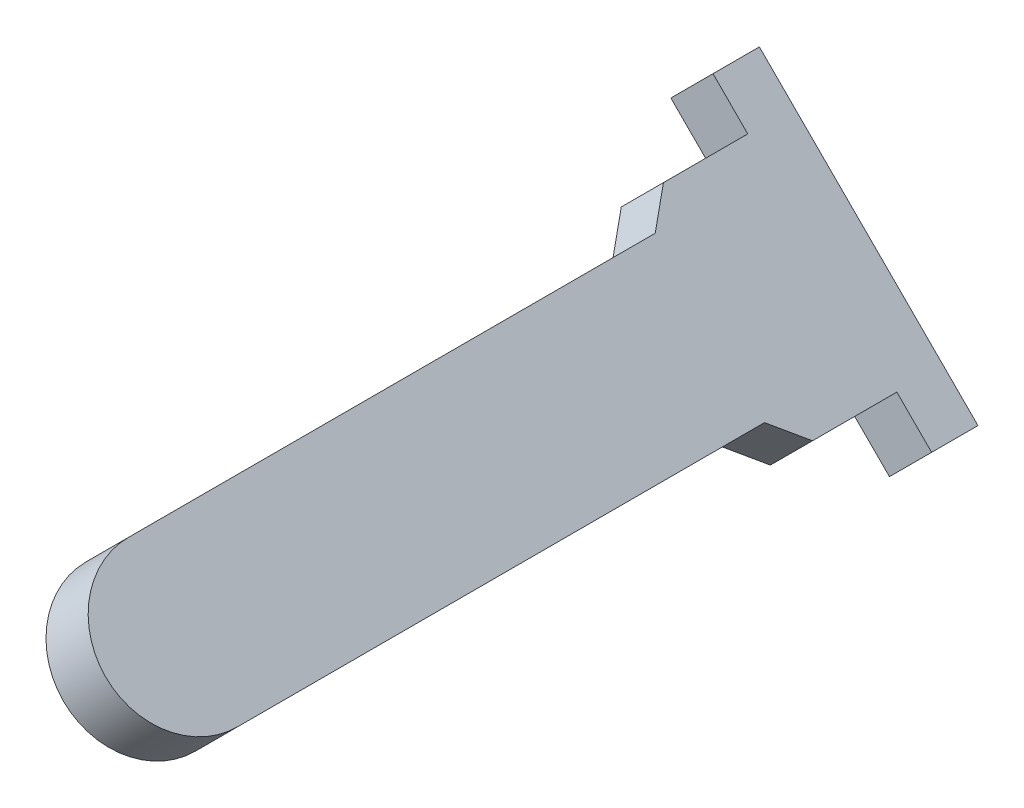
ISO-10303-21;
HEADER;
FILE_DESCRIPTION(('STEP AP214'),'2;1');
FILE_NAME('part.step','',(''),(''),'','','');
FILE_SCHEMA(('AUTOMOTIVE_DESIGN { 1 0 10303 214 1 1 1 1 }'));
ENDSEC;
DATA;
#1=APPLICATION_CONTEXT('core data for automotive mechanical design processes');
#2=APPLICATION_PROTOCOL_DEFINITION('international standard','automotive_design',2000,#1);
#3=PRODUCT_CONTEXT('',#1,'mechanical');
#4=PRODUCT('Part','Part','',(#3));
#5=PRODUCT_RELATED_PRODUCT_CATEGORY('part','',(#4));
#6=PRODUCT_DEFINITION_FORMATION('','',#4);
#7=PRODUCT_DEFINITION_CONTEXT('part definition',#1,'design');
#8=PRODUCT_DEFINITION('design','',#6,#7);
#9=PRODUCT_DEFINITION_SHAPE('','',#8);
#10=(LENGTH_UNIT() NAMED_UNIT(*) SI_UNIT(.MILLI.,.METRE.));
#11=(NAMED_UNIT(*) PLANE_ANGLE_UNIT() SI_UNIT($,.RADIAN.));
#12=(NAMED_UNIT(*) SI_UNIT($,.STERADIAN.) SOLID_ANGLE_UNIT());
#13=UNCERTAINTY_MEASURE_WITH_UNIT(LENGTH_MEASURE(1.E-05),#10,'distance_accuracy_value','');
#14=(GEOMETRIC_REPRESENTATION_CONTEXT(3) GLOBAL_UNCERTAINTY_ASSIGNED_CONTEXT((#13)) GLOBAL_UNIT_ASSIGNED_CONTEXT((#10,
#11,#12)) REPRESENTATION_CONTEXT('',''));
#15=CARTESIAN_POINT('',(0.,0.,0.));
#16=DIRECTION('',(0.,0.,1.));
#17=DIRECTION('',(1.,0.,0.));
#18=AXIS2_PLACEMENT_3D('',#15,#16,#17);
#19=CARTESIAN_POINT('',(-2.60380158952855,2.90380158952855,6.09300000637471));
#20=DIRECTION('',(0.707106781186549,0.707106781186546,0.));
#21=DIRECTION('',(-0.707106781186546,0.707106781186549,0.));
#22=AXIS2_PLACEMENT_3D('',#19,#20,#21);
#23=PLANE('',#22);
#24=CARTESIAN_POINT('',(-3.65718254069478,3.95718254069479,4.88));
#25=DIRECTION('',(0.707106781186556,0.707106781186539,0.));
#26=DIRECTION('',(-0.707106781186539,0.707106781186556,0.));
#27=AXIS2_PLACEMENT_3D('',#24,#25,#26);
#28=CIRCLE('',#27,0.550000000000002);
#29=CARTESIAN_POINT('',(-3.26827381104219,3.56827381104219,4.88000000192965));
#30=VERTEX_POINT('',#29);
#31=CARTESIAN_POINT('',(-4.04609127034739,4.3460912703474,4.88));
#32=VERTEX_POINT('',#31);
#33=EDGE_CURVE('E20',#30,#32,#28,.F.);
#34=ORIENTED_EDGE('',*,*,#33,.F.);
#35=DIRECTION('',(0.,0.,1.));
#36=VECTOR('',#35,1.);
#37=CARTESIAN_POINT('',(-3.26827381104219,3.56827381104219,5.375));
#38=LINE('',#37,#36);
#39=CARTESIAN_POINT('',(-3.26827381104219,3.56827381104219,1.13));
#40=VERTEX_POINT('',#39);
#41=EDGE_CURVE('E112',#40,#30,#38,.T.);
#42=ORIENTED_EDGE('',*,*,#41,.F.);
#43=DIRECTION('',(-0.5,0.5,0.707106781186547));
#44=VECTOR('',#43,1.);
#45=CARTESIAN_POINT('',(-3.12685245480488,3.42685245480488,0.930000000000001));
#46=LINE('',#45,#44);
#47=CARTESIAN_POINT('',(-3.12685245480488,3.42685245480488,0.930000000000001));
#48=VERTEX_POINT('',#47);
#49=EDGE_CURVE('E144',#48,#40,#46,.T.);
#50=ORIENTED_EDGE('',*,*,#49,.F.);
#51=DIRECTION('',(0.,0.,1.));
#52=VECTOR('',#51,1.);
#53=CARTESIAN_POINT('',(-3.12685245480488,3.42685245480488,6.09300000637471));
#54=LINE('',#53,#52);
#55=CARTESIAN_POINT('',(-3.12685245480488,3.42685245480488,0.33));
#56=VERTEX_POINT('',#55);
#57=EDGE_CURVE('E183',#48,#56,#54,.F.);
#58=ORIENTED_EDGE('',*,*,#57,.T.);
#59=DIRECTION('',(-0.707106781186546,0.707106781186549,0.));
#60=VECTOR('',#59,1.);
#61=CARTESIAN_POINT('',(-2.60380158952855,2.90380158952855,0.33));
#62=LINE('',#61,#60);
#63=CARTESIAN_POINT('',(-2.87936508138959,3.17936508138959,0.33));
#64=VERTEX_POINT('',#63);
#65=EDGE_CURVE('E165',#56,#64,#62,.F.);
#66=ORIENTED_EDGE('',*,*,#65,.T.);
#67=DIRECTION('',(0.,0.,1.));
#68=VECTOR('',#67,1.);
#69=CARTESIAN_POINT('',(-2.87936508138959,3.17936508138959,6.09300000637471));
#70=LINE('',#69,#68);
#71=CARTESIAN_POINT('',(-2.87936508138959,3.17936508138959,0.));
#72=VERTEX_POINT('',#71);
#73=EDGE_CURVE('E162',#64,#72,#70,.F.);
#74=ORIENTED_EDGE('',*,*,#73,.T.);
#75=DIRECTION('',(0.707106781186545,-0.70710678118655,0.));
#76=VECTOR('',#75,1.);
#77=CARTESIAN_POINT('',(-4.43499999999999,4.735,0.));
#78=LINE('',#77,#76);
#79=CARTESIAN_POINT('',(-4.43499999999999,4.735,0.));
#80=VERTEX_POINT('',#79);
#81=EDGE_CURVE('E210',#80,#72,#78,.T.);
#82=ORIENTED_EDGE('',*,*,#81,.F.);
#83=DIRECTION('',(0.,0.,1.));
#84=VECTOR('',#83,1.);
#85=CARTESIAN_POINT('',(-4.43499999999999,4.735,-0.753));
#86=LINE('',#85,#84);
#87=CARTESIAN_POINT('',(-4.43499999999999,4.735,0.33));
#88=VERTEX_POINT('',#87);
#89=EDGE_CURVE('E216',#88,#80,#86,.F.);
#90=ORIENTED_EDGE('',*,*,#89,.F.);
#91=DIRECTION('',(-0.707106781186534,0.707106781186561,0.));
#92=VECTOR('',#91,1.);
#93=CARTESIAN_POINT('',(-4.1875126265847,4.4875126265847,0.33));
#94=LINE('',#93,#92);
#95=CARTESIAN_POINT('',(-4.1875126265847,4.4875126265847,0.33));
#96=VERTEX_POINT('',#95);
#97=EDGE_CURVE('E220',#96,#88,#94,.T.);
#98=ORIENTED_EDGE('',*,*,#97,.F.);
#99=DIRECTION('',(0.,0.,1.));
#100=VECTOR('',#99,1.);
#101=CARTESIAN_POINT('',(-4.1875126265847,4.48751262658471,-0.45));
#102=LINE('',#101,#100);
#103=CARTESIAN_POINT('',(-4.1875126265847,4.48751262658471,0.930000000000003));
#104=VERTEX_POINT('',#103);
#105=EDGE_CURVE('E172',#104,#96,#102,.F.);
#106=ORIENTED_EDGE('',*,*,#105,.F.);
#107=DIRECTION('',(-0.499999999999999,0.499999999999999,-0.707106781186548));
#108=VECTOR('',#107,1.);
#109=CARTESIAN_POINT('',(-4.04609127034739,4.3460912703474,1.13));
#110=LINE('',#109,#108);
#111=CARTESIAN_POINT('',(-4.04609127034739,4.3460912703474,1.13));
#112=VERTEX_POINT('',#111);
#113=EDGE_CURVE('E116',#112,#104,#110,.T.);
#114=ORIENTED_EDGE('',*,*,#113,.F.);
#115=DIRECTION('',(0.,0.,1.));
#116=VECTOR('',#115,1.);
#117=CARTESIAN_POINT('',(-4.04609127034739,4.3460912703474,0.635));
#118=LINE('',#117,#116);
#119=EDGE_CURVE('E114',#32,#112,#118,.F.);
#120=ORIENTED_EDGE('',*,*,#119,.F.);
#121=EDGE_LOOP('',(#34,#42,#50,#58,#66,#74,#82,#90,#98,#106,#114,#120));
#122=FACE_BOUND('',#121,.T.);
#123=ADVANCED_FACE('F16',(#122),#23,.T.);
#124=CARTESIAN_POINT('',(-4.53694033221676,2.3582422631681,1.17146118723546));
#125=DIRECTION('',(0.499999999999999,-0.500000000000002,0.707106781186547));
#126=DIRECTION('',(0.,-0.816496580927725,-0.577350269189628));
#127=AXIS2_PLACEMENT_3D('',#124,#125,#126);
#128=PLANE('',#127);
#129=ORIENTED_EDGE('',*,*,#49,.T.);
#130=DIRECTION('',(0.707106781186549,0.707106781186546,0.));
#131=VECTOR('',#130,1.);
#132=CARTESIAN_POINT('',(-4.14253787975412,2.69400974233027,1.13));
#133=LINE('',#132,#131);
#134=CARTESIAN_POINT('',(-3.56827381104219,3.26827381104219,1.13));
#135=VERTEX_POINT('',#134);
#136=EDGE_CURVE('E141',#135,#40,#133,.T.);
#137=ORIENTED_EDGE('',*,*,#136,.F.);
#138=DIRECTION('',(-0.5,0.500000000000003,0.707106781186546));
#139=VECTOR('',#138,1.);
#140=CARTESIAN_POINT('',(-3.42685245480488,3.12685245480488,0.93));
#141=LINE('',#140,#139);
#142=CARTESIAN_POINT('',(-3.42685245480488,3.12685245480488,0.930000000000001));
#143=VERTEX_POINT('',#142);
#144=EDGE_CURVE('E147',#143,#135,#141,.T.);
#145=ORIENTED_EDGE('',*,*,#144,.F.);
#146=DIRECTION('',(0.707106781186549,0.707106781186546,0.));
#147=VECTOR('',#146,1.);
#148=CARTESIAN_POINT('',(-4.00111652351681,2.55258838609296,0.93));
#149=LINE('',#148,#147);
#150=EDGE_CURVE('E153',#48,#143,#149,.F.);
#151=ORIENTED_EDGE('',*,*,#150,.F.);
#152=EDGE_LOOP('',(#129,#137,#145,#151));
#153=FACE_BOUND('',#152,.T.);
#154=ADVANCED_FACE('F260',(#153),#128,.T.);
#155=CARTESIAN_POINT('',(-4.14253787975412,2.69400974233027,5.375));
#156=DIRECTION('',(0.707106781186546,-0.707106781186549,0.));
#157=DIRECTION('',(0.707106781186549,0.707106781186546,0.));
#158=AXIS2_PLACEMENT_3D('',#155,#156,#157);
#159=PLANE('',#158);
#160=ORIENTED_EDGE('',*,*,#136,.T.);
#161=ORIENTED_EDGE('',*,*,#41,.T.);
#162=DIRECTION('',(0.70710678118655,0.707106781186545,0.));
#163=VECTOR('',#162,1.);
#164=CARTESIAN_POINT('',(-3.41827380899328,3.4182738130911,4.8800000038593));
#165=LINE('',#164,#163);
#166=CARTESIAN_POINT('',(-3.5682738110422,3.26827381104219,4.88000000192965));
#167=VERTEX_POINT('',#166);
#168=EDGE_CURVE('E111',#167,#30,#165,.T.);
#169=ORIENTED_EDGE('',*,*,#168,.F.);
#170=DIRECTION('',(0.,0.,1.));
#171=VECTOR('',#170,1.);
#172=CARTESIAN_POINT('',(-3.56827381104219,3.26827381104219,-0.663000000579519));
#173=LINE('',#172,#171);
#174=EDGE_CURVE('E150',#135,#167,#173,.T.);
#175=ORIENTED_EDGE('',*,*,#174,.F.);
#176=EDGE_LOOP('',(#160,#161,#169,#175));
#177=FACE_BOUND('',#176,.T.);
#178=ADVANCED_FACE('F262',(#177),#159,.T.);
#179=CARTESIAN_POINT('',(-4.5738730166877,3.04049206470189,4.88));
#180=DIRECTION('',(0.707106781186556,0.707106781186539,0.));
#181=DIRECTION('',(-0.707106781186539,0.707106781186556,0.));
#182=AXIS2_PLACEMENT_3D('',#179,#180,#181);
#183=CYLINDRICAL_SURFACE('',#182,0.550000000000002);
#184=CARTESIAN_POINT('',(-3.95718254069479,3.65718254069479,4.88));
#185=DIRECTION('',(0.707106781186556,0.707106781186539,0.));
#186=DIRECTION('',(-0.707106781186539,0.707106781186556,0.));
#187=AXIS2_PLACEMENT_3D('',#184,#185,#186);
#188=CIRCLE('',#187,0.550000000000002);
#189=CARTESIAN_POINT('',(-4.34609127034739,4.0460912703474,4.88));
#190=VERTEX_POINT('',#189);
#191=EDGE_CURVE('E194',#167,#190,#188,.F.);
#192=ORIENTED_EDGE('',*,*,#191,.F.);
#193=ORIENTED_EDGE('',*,*,#168,.T.);
#194=ORIENTED_EDGE('',*,*,#33,.T.);
#195=DIRECTION('',(-0.707106781186549,-0.707106781186546,0.));
#196=VECTOR('',#195,1.);
#197=CARTESIAN_POINT('',(-4.92035533905932,3.47182720163547,4.88));
#198=LINE('',#197,#196);
#199=EDGE_CURVE('E109',#190,#32,#198,.F.);
#200=ORIENTED_EDGE('',*,*,#199,.F.);
#201=EDGE_LOOP('',(#192,#193,#194,#200));
#202=FACE_BOUND('',#201,.T.);
#203=ADVANCED_FACE('F18',(#202),#183,.T.);
#204=CARTESIAN_POINT('',(-4.92035533905932,3.47182720163547,0.635));
#205=DIRECTION('',(-0.707106781186546,0.707106781186549,0.));
#206=DIRECTION('',(-0.707106781186549,-0.707106781186546,0.));
#207=AXIS2_PLACEMENT_3D('',#204,#205,#206);
#208=PLANE('',#207);
#209=DIRECTION('',(0.70710678118655,0.707106781186545,0.));
#210=VECTOR('',#209,1.);
#211=CARTESIAN_POINT('',(-4.34609127034739,4.0460912703474,1.13));
#212=LINE('',#211,#210);
#213=CARTESIAN_POINT('',(-4.34609127034739,4.0460912703474,1.13));
#214=VERTEX_POINT('',#213);
#215=EDGE_CURVE('E136',#214,#112,#212,.T.);
#216=ORIENTED_EDGE('',*,*,#215,.F.);
#217=DIRECTION('',(0.,0.,1.));
#218=VECTOR('',#217,1.);
#219=CARTESIAN_POINT('',(-4.34609127034739,4.0460912703474,-0.663000000579519));
#220=LINE('',#219,#218);
#221=EDGE_CURVE('E122',#190,#214,#220,.F.);
#222=ORIENTED_EDGE('',*,*,#221,.F.);
#223=ORIENTED_EDGE('',*,*,#199,.T.);
#224=ORIENTED_EDGE('',*,*,#119,.T.);
#225=EDGE_LOOP('',(#216,#222,#223,#224));
#226=FACE_BOUND('',#225,.T.);
#227=ADVANCED_FACE('F120',(#226),#208,.T.);
#228=CARTESIAN_POINT('',(-5.45617914775927,3.27748107871062,0.888538812764545));
#229=DIRECTION('',(-0.499999999999999,0.500000000000002,0.707106781186547));
#230=DIRECTION('',(0.,-0.816496580927725,0.577350269189628));
#231=AXIS2_PLACEMENT_3D('',#228,#229,#230);
#232=PLANE('',#231);
#233=DIRECTION('',(-0.499999999999997,0.500000000000004,-0.707106781186547));
#234=VECTOR('',#233,1.);
#235=CARTESIAN_POINT('',(-4.34609127034739,4.0460912703474,1.13));
#236=LINE('',#235,#234);
#237=CARTESIAN_POINT('',(-4.4875126265847,4.18751262658471,0.930000000000001));
#238=VERTEX_POINT('',#237);
#239=EDGE_CURVE('E130',#214,#238,#236,.T.);
#240=ORIENTED_EDGE('',*,*,#239,.F.);
#241=ORIENTED_EDGE('',*,*,#215,.T.);
#242=ORIENTED_EDGE('',*,*,#113,.T.);
#243=DIRECTION('',(-0.707106781186549,-0.707106781186546,0.));
#244=VECTOR('',#243,1.);
#245=CARTESIAN_POINT('',(-5.06177669529663,3.61324855787278,0.93));
#246=LINE('',#245,#244);
#247=EDGE_CURVE('E138',#238,#104,#246,.F.);
#248=ORIENTED_EDGE('',*,*,#247,.F.);
#249=EDGE_LOOP('',(#240,#241,#242,#248));
#250=FACE_BOUND('',#249,.T.);
#251=ADVANCED_FACE('F294',(#250),#232,.T.);
#252=CARTESIAN_POINT('',(-5.06177669529663,3.61324855787278,-0.45));
#253=DIRECTION('',(-0.707106781186546,0.707106781186549,0.));
#254=DIRECTION('',(-0.707106781186549,-0.707106781186546,0.));
#255=AXIS2_PLACEMENT_3D('',#252,#253,#254);
#256=PLANE('',#255);
#257=DIRECTION('',(0.70710678118656,0.707106781186535,0.));
#258=VECTOR('',#257,1.);
#259=CARTESIAN_POINT('',(-4.4875126265847,4.18751262658471,0.33));
#260=LINE('',#259,#258);
#261=CARTESIAN_POINT('',(-4.4875126265847,4.18751262658471,0.33));
#262=VERTEX_POINT('',#261);
#263=EDGE_CURVE('E128',#262,#96,#260,.T.);
#264=ORIENTED_EDGE('',*,*,#263,.F.);
#265=DIRECTION('',(0.,0.,1.));
#266=VECTOR('',#265,1.);
#267=CARTESIAN_POINT('',(-4.4875126265847,4.18751262658471,-0.663000000579519));
#268=LINE('',#267,#266);
#269=EDGE_CURVE('E133',#238,#262,#268,.F.);
#270=ORIENTED_EDGE('',*,*,#269,.F.);
#271=ORIENTED_EDGE('',*,*,#247,.T.);
#272=ORIENTED_EDGE('',*,*,#105,.T.);
#273=EDGE_LOOP('',(#264,#270,#271,#272));
#274=FACE_BOUND('',#273,.T.);
#275=ADVANCED_FACE('F232',(#274),#256,.T.);
#276=CARTESIAN_POINT('',(-5.50974873734152,3.41276388924318,0.33));
#277=DIRECTION('',(0.,0.,1.));
#278=DIRECTION('',(1.,0.,0.));
#279=AXIS2_PLACEMENT_3D('',#276,#277,#278);
#280=PLANE('',#279);
#281=DIRECTION('',(-0.707106781186549,-0.707106781186546,0.));
#282=VECTOR('',#281,1.);
#283=CARTESIAN_POINT('',(-5.30926406871192,3.86073593128807,0.33));
#284=LINE('',#283,#282);
#285=CARTESIAN_POINT('',(-4.73499999999999,4.435,0.33));
#286=VERTEX_POINT('',#285);
#287=EDGE_CURVE('E218',#286,#88,#284,.F.);
#288=ORIENTED_EDGE('',*,*,#287,.F.);
#289=DIRECTION('',(0.707106781186546,-0.707106781186549,0.));
#290=VECTOR('',#289,1.);
#291=CARTESIAN_POINT('',(-2.90380158952855,2.60380158952855,0.33));
#292=LINE('',#291,#290);
#293=EDGE_CURVE('E228',#262,#286,#292,.F.);
#294=ORIENTED_EDGE('',*,*,#293,.F.);
#295=ORIENTED_EDGE('',*,*,#263,.T.);
#296=ORIENTED_EDGE('',*,*,#97,.T.);
#297=EDGE_LOOP('',(#288,#294,#295,#296));
#298=FACE_BOUND('',#297,.T.);
#299=ADVANCED_FACE('F226',(#298),#280,.T.);
#300=CARTESIAN_POINT('',(-5.30926406871192,3.86073593128807,-0.753));
#301=DIRECTION('',(-0.707106781186546,0.707106781186549,0.));
#302=DIRECTION('',(-0.707106781186549,-0.707106781186546,0.));
#303=AXIS2_PLACEMENT_3D('',#300,#301,#302);
#304=PLANE('',#303);
#305=DIRECTION('',(0.707106781186547,0.707106781186549,0.));
#306=VECTOR('',#305,1.);
#307=CARTESIAN_POINT('',(-4.73499999999999,4.435,0.));
#308=LINE('',#307,#306);
#309=CARTESIAN_POINT('',(-4.73499999999999,4.435,0.));
#310=VERTEX_POINT('',#309);
#311=EDGE_CURVE('E213',#310,#80,#308,.T.);
#312=ORIENTED_EDGE('',*,*,#311,.F.);
#313=DIRECTION('',(0.,0.,1.));
#314=VECTOR('',#313,1.);
#315=CARTESIAN_POINT('',(-4.73499999999999,4.435,-0.663000000579519));
#316=LINE('',#315,#314);
#317=EDGE_CURVE('E238',#286,#310,#316,.F.);
#318=ORIENTED_EDGE('',*,*,#317,.F.);
#319=ORIENTED_EDGE('',*,*,#287,.T.);
#320=ORIENTED_EDGE('',*,*,#89,.T.);
#321=EDGE_LOOP('',(#312,#318,#319,#320));
#322=FACE_BOUND('',#321,.T.);
#323=ADVANCED_FACE('F236',(#322),#304,.T.);
#324=CARTESIAN_POINT('',(-5.04056349186103,2.57380158952855,0.));
#325=DIRECTION('',(0.,0.,-1.));
#326=DIRECTION('',(-1.,0.,0.));
#327=AXIS2_PLACEMENT_3D('',#324,#325,#326);
#328=PLANE('',#327);
#329=ORIENTED_EDGE('',*,*,#81,.T.);
#330=DIRECTION('',(0.707106781186549,0.707106781186546,0.));
#331=VECTOR('',#330,1.);
#332=CARTESIAN_POINT('',(-3.75362915010152,2.30510101267766,0.));
#333=LINE('',#332,#331);
#334=CARTESIAN_POINT('',(-3.17936508138959,2.87936508138959,0.));
#335=VERTEX_POINT('',#334);
#336=EDGE_CURVE('E207',#335,#72,#333,.T.);
#337=ORIENTED_EDGE('',*,*,#336,.F.);
#338=DIRECTION('',(0.707106781186546,-0.707106781186549,0.));
#339=VECTOR('',#338,1.);
#340=CARTESIAN_POINT('',(-2.90380158952855,2.60380158952855,0.));
#341=LINE('',#340,#339);
#342=EDGE_CURVE('E241',#310,#335,#341,.T.);
#343=ORIENTED_EDGE('',*,*,#342,.F.);
#344=ORIENTED_EDGE('',*,*,#311,.T.);
#345=EDGE_LOOP('',(#329,#337,#343,#344));
#346=FACE_BOUND('',#345,.T.);
#347=ADVANCED_FACE('F284',(#346),#328,.T.);
#348=CARTESIAN_POINT('',(-3.75362915010152,2.30510101267766,1.083));
#349=DIRECTION('',(0.707106781186546,-0.707106781186549,0.));
#350=DIRECTION('',(0.707106781186549,0.707106781186546,0.));
#351=AXIS2_PLACEMENT_3D('',#348,#349,#350);
#352=PLANE('',#351);
#353=ORIENTED_EDGE('',*,*,#336,.T.);
#354=ORIENTED_EDGE('',*,*,#73,.F.);
#355=DIRECTION('',(0.707106781186547,0.707106781186547,0.));
#356=VECTOR('',#355,1.);
#357=CARTESIAN_POINT('',(-3.17936508138959,2.87936508138959,0.33));
#358=LINE('',#357,#356);
#359=CARTESIAN_POINT('',(-3.17936508138959,2.87936508138959,0.33));
#360=VERTEX_POINT('',#359);
#361=EDGE_CURVE('E156',#360,#64,#358,.T.);
#362=ORIENTED_EDGE('',*,*,#361,.F.);
#363=DIRECTION('',(0.,0.,1.));
#364=VECTOR('',#363,1.);
#365=CARTESIAN_POINT('',(-3.17936508138959,2.87936508138959,-0.663000000579519));
#366=LINE('',#365,#364);
#367=EDGE_CURVE('E249',#335,#360,#366,.T.);
#368=ORIENTED_EDGE('',*,*,#367,.F.);
#369=EDGE_LOOP('',(#353,#354,#362,#368));
#370=FACE_BOUND('',#369,.T.);
#371=ADVANCED_FACE('F281',(#370),#352,.T.);
#372=CARTESIAN_POINT('',(-4.20160119214641,2.10461634404806,0.33));
#373=DIRECTION('',(0.,0.,1.));
#374=DIRECTION('',(1.,0.,0.));
#375=AXIS2_PLACEMENT_3D('',#372,#373,#374);
#376=PLANE('',#375);
#377=ORIENTED_EDGE('',*,*,#361,.T.);
#378=ORIENTED_EDGE('',*,*,#65,.F.);
#379=DIRECTION('',(0.707106781186549,0.707106781186546,0.));
#380=VECTOR('',#379,1.);
#381=CARTESIAN_POINT('',(-4.00111652351681,2.55258838609296,0.33));
#382=LINE('',#381,#380);
#383=CARTESIAN_POINT('',(-3.42685245480488,3.12685245480488,0.33));
#384=VERTEX_POINT('',#383);
#385=EDGE_CURVE('E35',#384,#56,#382,.T.);
#386=ORIENTED_EDGE('',*,*,#385,.F.);
#387=DIRECTION('',(0.707106781186546,-0.707106781186549,0.));
#388=VECTOR('',#387,1.);
#389=CARTESIAN_POINT('',(-2.90380158952855,2.60380158952855,0.33));
#390=LINE('',#389,#388);
#391=EDGE_CURVE('E26',#360,#384,#390,.F.);
#392=ORIENTED_EDGE('',*,*,#391,.F.);
#393=EDGE_LOOP('',(#377,#378,#386,#392));
#394=FACE_BOUND('',#393,.T.);
#395=ADVANCED_FACE('F253',(#394),#376,.T.);
#396=CARTESIAN_POINT('',(-4.00111652351681,2.55258838609296,1.71));
#397=DIRECTION('',(0.707106781186546,-0.707106781186549,0.));
#398=DIRECTION('',(0.707106781186549,0.707106781186546,0.));
#399=AXIS2_PLACEMENT_3D('',#396,#397,#398);
#400=PLANE('',#399);
#401=ORIENTED_EDGE('',*,*,#385,.T.);
#402=ORIENTED_EDGE('',*,*,#57,.F.);
#403=ORIENTED_EDGE('',*,*,#150,.T.);
#404=DIRECTION('',(0.,0.,1.));
#405=VECTOR('',#404,1.);
#406=CARTESIAN_POINT('',(-3.42685245480488,3.12685245480488,-0.663000000579519));
#407=LINE('',#406,#405);
#408=EDGE_CURVE('E11',#384,#143,#407,.T.);
#409=ORIENTED_EDGE('',*,*,#408,.F.);
#410=EDGE_LOOP('',(#401,#402,#403,#409));
#411=FACE_BOUND('',#410,.T.);
#412=ADVANCED_FACE('F258',(#411),#400,.T.);
#413=CARTESIAN_POINT('',(-2.90380158952855,2.60380158952855,-0.663000000579519));
#414=DIRECTION('',(-0.707106781186549,-0.707106781186546,0.));
#415=DIRECTION('',(0.707106781186546,-0.707106781186549,0.));
#416=AXIS2_PLACEMENT_3D('',#413,#414,#415);
#417=PLANE('',#416);
#418=ORIENTED_EDGE('',*,*,#391,.T.);
#419=ORIENTED_EDGE('',*,*,#408,.T.);
#420=ORIENTED_EDGE('',*,*,#144,.T.);
#421=ORIENTED_EDGE('',*,*,#174,.T.);
#422=ORIENTED_EDGE('',*,*,#191,.T.);
#423=ORIENTED_EDGE('',*,*,#221,.T.);
#424=ORIENTED_EDGE('',*,*,#239,.T.);
#425=ORIENTED_EDGE('',*,*,#269,.T.);
#426=ORIENTED_EDGE('',*,*,#293,.T.);
#427=ORIENTED_EDGE('',*,*,#317,.T.);
#428=ORIENTED_EDGE('',*,*,#342,.T.);
#429=ORIENTED_EDGE('',*,*,#367,.T.);
#430=EDGE_LOOP('',(#418,#419,#420,#421,#422,#423,#424,#425,#426,#427,#428,#429));
#431=FACE_BOUND('',#430,.T.);
#432=ADVANCED_FACE('F244',(#431),#417,.T.);
#433=CLOSED_SHELL('',(#123,#154,#178,#203,#227,#251,#275,#299,#323,#347,#371,#395,#412,#432));
#434=MANIFOLD_SOLID_BREP('B1',#433);
#435=ADVANCED_BREP_SHAPE_REPRESENTATION('',(#18,#434),#14);
#436=SHAPE_DEFINITION_REPRESENTATION(#9,#435);
ENDSEC;
END-ISO-10303-21;
